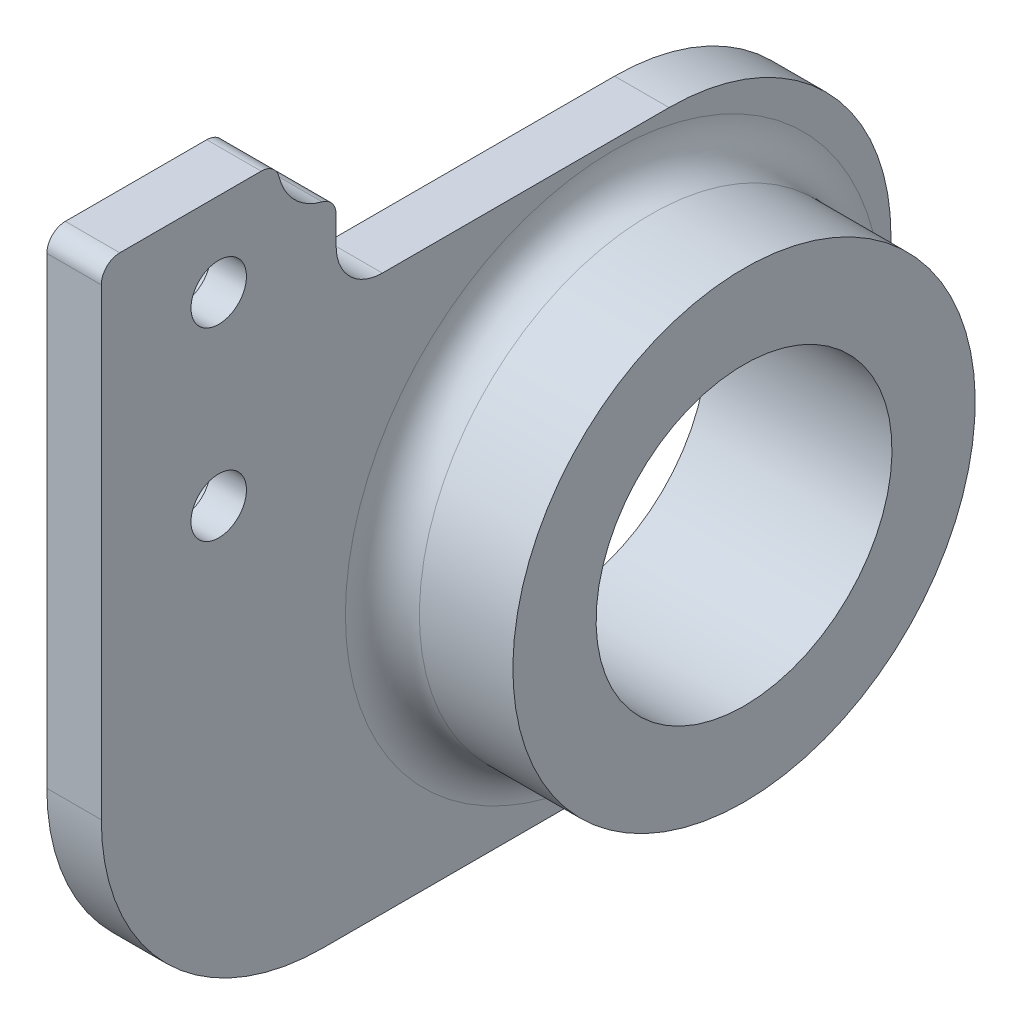
ISO-10303-21;
HEADER;
FILE_DESCRIPTION(('STEP AP214'),'2;1');
FILE_NAME('part.step','',(''),(''),'','','');
FILE_SCHEMA(('AUTOMOTIVE_DESIGN { 1 0 10303 214 1 1 1 1 }'));
ENDSEC;
DATA;
#1=APPLICATION_CONTEXT('core data for automotive mechanical design processes');
#2=APPLICATION_PROTOCOL_DEFINITION('international standard','automotive_design',2000,#1);
#3=PRODUCT_CONTEXT('',#1,'mechanical');
#4=PRODUCT('Part','Part','',(#3));
#5=PRODUCT_RELATED_PRODUCT_CATEGORY('part','',(#4));
#6=PRODUCT_DEFINITION_FORMATION('','',#4);
#7=PRODUCT_DEFINITION_CONTEXT('part definition',#1,'design');
#8=PRODUCT_DEFINITION('design','',#6,#7);
#9=PRODUCT_DEFINITION_SHAPE('','',#8);
#10=(LENGTH_UNIT() NAMED_UNIT(*) SI_UNIT(.MILLI.,.METRE.));
#11=(NAMED_UNIT(*) PLANE_ANGLE_UNIT() SI_UNIT($,.RADIAN.));
#12=(NAMED_UNIT(*) SI_UNIT($,.STERADIAN.) SOLID_ANGLE_UNIT());
#13=UNCERTAINTY_MEASURE_WITH_UNIT(LENGTH_MEASURE(1.E-05),#10,'distance_accuracy_value','');
#14=(GEOMETRIC_REPRESENTATION_CONTEXT(3) GLOBAL_UNCERTAINTY_ASSIGNED_CONTEXT((#13)) GLOBAL_UNIT_ASSIGNED_CONTEXT((#10,
#11,#12)) REPRESENTATION_CONTEXT('',''));
#15=CARTESIAN_POINT('',(0.,0.,0.));
#16=DIRECTION('',(0.,0.,1.));
#17=DIRECTION('',(1.,0.,0.));
#18=AXIS2_PLACEMENT_3D('',#15,#16,#17);
#19=CARTESIAN_POINT('',(-19.525,-4.525,19.05));
#20=DIRECTION('',(1.,0.,0.));
#21=DIRECTION('',(0.,1.,0.));
#22=AXIS2_PLACEMENT_3D('',#19,#20,#21);
#23=CYLINDRICAL_SURFACE('',#22,1.5);
#24=CARTESIAN_POINT('',(-16.5811440184248,-4.525,19.05));
#25=DIRECTION('',(-1.,0.,0.));
#26=DIRECTION('',(0.,-1.,0.));
#27=AXIS2_PLACEMENT_3D('',#24,#25,#26);
#28=CIRCLE('',#27,1.5);
#29=CARTESIAN_POINT('',(-16.5811440184248,-6.025,19.05));
#30=VERTEX_POINT('',#29);
#31=EDGE_CURVE('E329',#30,#30,#28,.T.);
#32=ORIENTED_EDGE('',*,*,#31,.F.);
#33=EDGE_LOOP('',(#32));
#34=FACE_BOUND('',#33,.T.);
#35=CARTESIAN_POINT('',(-18.525,-4.525,19.05));
#36=DIRECTION('',(-1.,0.,0.));
#37=DIRECTION('',(0.,-1.,0.));
#38=AXIS2_PLACEMENT_3D('',#35,#36,#37);
#39=CIRCLE('',#38,1.5);
#40=CARTESIAN_POINT('',(-18.525,-6.025,19.05));
#41=VERTEX_POINT('',#40);
#42=EDGE_CURVE('E219',#41,#41,#39,.T.);
#43=ORIENTED_EDGE('',*,*,#42,.T.);
#44=EDGE_LOOP('',(#43));
#45=FACE_BOUND('',#44,.T.);
#46=ADVANCED_FACE('F43',(#34,#45),#23,.F.);
#47=CARTESIAN_POINT('',(-19.525,-14.525,19.05));
#48=DIRECTION('',(1.,0.,0.));
#49=DIRECTION('',(0.,1.,0.));
#50=AXIS2_PLACEMENT_3D('',#47,#48,#49);
#51=CYLINDRICAL_SURFACE('',#50,1.5);
#52=CARTESIAN_POINT('',(-16.5811440184248,-14.525,19.05));
#53=DIRECTION('',(-1.,0.,0.));
#54=DIRECTION('',(0.,-1.,0.));
#55=AXIS2_PLACEMENT_3D('',#52,#53,#54);
#56=CIRCLE('',#55,1.5);
#57=CARTESIAN_POINT('',(-16.5811440184248,-16.025,19.05));
#58=VERTEX_POINT('',#57);
#59=EDGE_CURVE('E157',#58,#58,#56,.T.);
#60=ORIENTED_EDGE('',*,*,#59,.F.);
#61=EDGE_LOOP('',(#60));
#62=FACE_BOUND('',#61,.T.);
#63=CARTESIAN_POINT('',(-18.525,-14.525,19.05));
#64=DIRECTION('',(-1.,0.,0.));
#65=DIRECTION('',(0.,-1.,0.));
#66=AXIS2_PLACEMENT_3D('',#63,#64,#65);
#67=CIRCLE('',#66,1.5);
#68=CARTESIAN_POINT('',(-18.525,-16.025,19.05));
#69=VERTEX_POINT('',#68);
#70=EDGE_CURVE('E216',#69,#69,#67,.T.);
#71=ORIENTED_EDGE('',*,*,#70,.T.);
#72=EDGE_LOOP('',(#71));
#73=FACE_BOUND('',#72,.T.);
#74=ADVANCED_FACE('F238',(#62,#73),#51,.F.);
#75=CARTESIAN_POINT('',(0.,0.,12.7));
#76=DIRECTION('',(0.,0.,1.));
#77=DIRECTION('',(1.,0.,0.));
#78=AXIS2_PLACEMENT_3D('',#75,#76,#77);
#79=PLANE('',#78);
#80=DIRECTION('',(0.,-1.,0.));
#81=VECTOR('',#80,1.);
#82=CARTESIAN_POINT('',(-16.5811440184248,0.,12.7));
#83=LINE('',#82,#81);
#84=CARTESIAN_POINT('',(-16.5811440184248,-4.0534707350615,12.7));
#85=VERTEX_POINT('',#84);
#86=CARTESIAN_POINT('',(-16.5811440184248,-5.55,12.7));
#87=VERTEX_POINT('',#86);
#88=EDGE_CURVE('E321',#85,#87,#83,.T.);
#89=ORIENTED_EDGE('',*,*,#88,.T.);
#90=DIRECTION('',(-1.,0.,0.));
#91=VECTOR('',#90,1.);
#92=CARTESIAN_POINT('',(0.,-5.55000000000001,12.7));
#93=LINE('',#92,#91);
#94=CARTESIAN_POINT('',(-19.525,-5.55,12.7));
#95=VERTEX_POINT('',#94);
#96=EDGE_CURVE('E175',#87,#95,#93,.T.);
#97=ORIENTED_EDGE('',*,*,#96,.T.);
#98=DIRECTION('',(0.,-1.,0.));
#99=VECTOR('',#98,1.);
#100=CARTESIAN_POINT('',(-19.525,-19.05,12.7));
#101=LINE('',#100,#99);
#102=CARTESIAN_POINT('',(-19.525,-4.0534707350615,12.7));
#103=VERTEX_POINT('',#102);
#104=EDGE_CURVE('E335',#103,#95,#101,.T.);
#105=ORIENTED_EDGE('',*,*,#104,.F.);
#106=DIRECTION('',(-1.,0.,0.));
#107=VECTOR('',#106,1.);
#108=CARTESIAN_POINT('',(-8.98025612106915,-4.0534707350615,12.7));
#109=LINE('',#108,#107);
#110=EDGE_CURVE('E173',#103,#85,#109,.F.);
#111=ORIENTED_EDGE('',*,*,#110,.T.);
#112=EDGE_LOOP('',(#89,#97,#105,#111));
#113=FACE_BOUND('',#112,.T.);
#114=ADVANCED_FACE('F245',(#113),#79,.F.);
#115=CARTESIAN_POINT('',(-19.525,0.,12.7));
#116=DIRECTION('',(0.,-1.,0.));
#117=DIRECTION('',(0.,0.,-1.));
#118=AXIS2_PLACEMENT_3D('',#115,#116,#117);
#119=PLANE('',#118);
#120=DIRECTION('',(1.,0.,0.));
#121=VECTOR('',#120,1.);
#122=CARTESIAN_POINT('',(-13.6372880368496,0.,24.4));
#123=LINE('',#122,#121);
#124=CARTESIAN_POINT('',(-19.525,0.,24.4));
#125=VERTEX_POINT('',#124);
#126=CARTESIAN_POINT('',(-16.5811440184248,0.,24.4));
#127=VERTEX_POINT('',#126);
#128=EDGE_CURVE('E166',#125,#127,#123,.T.);
#129=ORIENTED_EDGE('',*,*,#128,.T.);
#130=DIRECTION('',(0.,0.,1.));
#131=VECTOR('',#130,1.);
#132=CARTESIAN_POINT('',(-16.5811440184248,0.,-0.842098790918986));
#133=LINE('',#132,#131);
#134=CARTESIAN_POINT('',(-16.5811440184248,0.,16.7534707350615));
#135=VERTEX_POINT('',#134);
#136=EDGE_CURVE('E149',#135,#127,#133,.T.);
#137=ORIENTED_EDGE('',*,*,#136,.F.);
#138=DIRECTION('',(-1.,0.,0.));
#139=VECTOR('',#138,1.);
#140=CARTESIAN_POINT('',(-19.525,0.,16.7534707350615));
#141=LINE('',#140,#139);
#142=CARTESIAN_POINT('',(-19.525,0.,16.7534707350615));
#143=VERTEX_POINT('',#142);
#144=EDGE_CURVE('E163',#135,#143,#141,.T.);
#145=ORIENTED_EDGE('',*,*,#144,.T.);
#146=DIRECTION('',(0.,0.,-1.));
#147=VECTOR('',#146,1.);
#148=CARTESIAN_POINT('',(-19.525,0.,12.7));
#149=LINE('',#148,#147);
#150=EDGE_CURVE('E340',#125,#143,#149,.T.);
#151=ORIENTED_EDGE('',*,*,#150,.F.);
#152=EDGE_LOOP('',(#129,#137,#145,#151));
#153=FACE_BOUND('',#152,.T.);
#154=ADVANCED_FACE('F161',(#153),#119,.F.);
#155=CARTESIAN_POINT('',(0.,0.,25.4));
#156=DIRECTION('',(0.,0.,1.));
#157=DIRECTION('',(1.,0.,0.));
#158=AXIS2_PLACEMENT_3D('',#155,#156,#157);
#159=PLANE('',#158);
#160=DIRECTION('',(0.,1.,0.));
#161=VECTOR('',#160,1.);
#162=CARTESIAN_POINT('',(-19.525,0.,25.4));
#163=LINE('',#162,#161);
#164=CARTESIAN_POINT('',(-19.525,-26.05,25.4));
#165=VERTEX_POINT('',#164);
#166=CARTESIAN_POINT('',(-19.525,-1.,25.4));
#167=VERTEX_POINT('',#166);
#168=EDGE_CURVE('E338',#165,#167,#163,.T.);
#169=ORIENTED_EDGE('',*,*,#168,.F.);
#170=DIRECTION('',(-1.,0.,0.));
#171=VECTOR('',#170,1.);
#172=CARTESIAN_POINT('',(0.,-26.05,25.4));
#173=LINE('',#172,#171);
#174=CARTESIAN_POINT('',(-16.5811440184248,-26.05,25.4));
#175=VERTEX_POINT('',#174);
#176=EDGE_CURVE('E202',#165,#175,#173,.F.);
#177=ORIENTED_EDGE('',*,*,#176,.T.);
#178=DIRECTION('',(0.,-1.,0.));
#179=VECTOR('',#178,1.);
#180=CARTESIAN_POINT('',(-16.5811440184248,0.,25.4));
#181=LINE('',#180,#179);
#182=CARTESIAN_POINT('',(-16.5811440184248,-1.,25.4));
#183=VERTEX_POINT('',#182);
#184=EDGE_CURVE('E167',#183,#175,#181,.T.);
#185=ORIENTED_EDGE('',*,*,#184,.F.);
#186=DIRECTION('',(1.,0.,0.));
#187=VECTOR('',#186,1.);
#188=CARTESIAN_POINT('',(-19.525,-1.,25.4));
#189=LINE('',#188,#187);
#190=EDGE_CURVE('E342',#183,#167,#189,.F.);
#191=ORIENTED_EDGE('',*,*,#190,.T.);
#192=EDGE_LOOP('',(#169,#177,#185,#191));
#193=FACE_BOUND('',#192,.T.);
#194=ADVANCED_FACE('F256',(#193),#159,.T.);
#195=CARTESIAN_POINT('',(-19.525,0.,0.));
#196=DIRECTION('',(1.,0.,0.));
#197=DIRECTION('',(0.,1.,0.));
#198=AXIS2_PLACEMENT_3D('',#195,#196,#197);
#199=PLANE('',#198);
#200=CARTESIAN_POINT('',(-19.525,-14.525,19.05));
#201=DIRECTION('',(-1.,0.,0.));
#202=DIRECTION('',(0.,-1.,0.));
#203=AXIS2_PLACEMENT_3D('',#200,#201,#202);
#204=CIRCLE('',#203,2.5);
#205=CARTESIAN_POINT('',(-19.525,-17.025,19.05));
#206=VERTEX_POINT('',#205);
#207=EDGE_CURVE('E382',#206,#206,#204,.T.);
#208=ORIENTED_EDGE('',*,*,#207,.F.);
#209=EDGE_LOOP('',(#208));
#210=FACE_BOUND('',#209,.T.);
#211=CARTESIAN_POINT('',(-19.525,-4.525,19.05));
#212=DIRECTION('',(-1.,0.,0.));
#213=DIRECTION('',(0.,-1.,0.));
#214=AXIS2_PLACEMENT_3D('',#211,#212,#213);
#215=CIRCLE('',#214,2.5);
#216=CARTESIAN_POINT('',(-19.525,-7.025,19.05));
#217=VERTEX_POINT('',#216);
#218=EDGE_CURVE('E376',#217,#217,#215,.T.);
#219=ORIENTED_EDGE('',*,*,#218,.F.);
#220=EDGE_LOOP('',(#219));
#221=FACE_BOUND('',#220,.T.);
#222=DIRECTION('',(0.,0.,1.));
#223=VECTOR('',#222,1.);
#224=CARTESIAN_POINT('',(-19.525,-38.05,25.4));
#225=LINE('',#224,#223);
#226=CARTESIAN_POINT('',(-19.525,-38.05,-5.29999999999999));
#227=VERTEX_POINT('',#226);
#228=CARTESIAN_POINT('',(-19.525,-38.05,13.4));
#229=VERTEX_POINT('',#228);
#230=EDGE_CURVE('E314',#227,#229,#225,.T.);
#231=ORIENTED_EDGE('',*,*,#230,.T.);
#232=CARTESIAN_POINT('',(-19.525,-26.05,13.4));
#233=DIRECTION('',(1.,0.,0.));
#234=DIRECTION('',(0.,1.,0.));
#235=AXIS2_PLACEMENT_3D('',#232,#233,#234);
#236=CIRCLE('',#235,12.);
#237=EDGE_CURVE('E200',#229,#165,#236,.F.);
#238=ORIENTED_EDGE('',*,*,#237,.T.);
#239=ORIENTED_EDGE('',*,*,#168,.T.);
#240=CARTESIAN_POINT('',(-19.525,-1.,24.4));
#241=DIRECTION('',(1.,0.,0.));
#242=DIRECTION('',(0.,1.,0.));
#243=AXIS2_PLACEMENT_3D('',#240,#241,#242);
#244=CIRCLE('',#243,1.);
#245=EDGE_CURVE('E348',#167,#125,#244,.F.);
#246=ORIENTED_EDGE('',*,*,#245,.T.);
#247=ORIENTED_EDGE('',*,*,#150,.T.);
#248=CARTESIAN_POINT('',(-19.525,-0.999999999999999,16.7534707350615));
#249=DIRECTION('',(1.,0.,0.));
#250=DIRECTION('',(0.,1.,0.));
#251=AXIS2_PLACEMENT_3D('',#248,#249,#250);
#252=CIRCLE('',#251,1.);
#253=CARTESIAN_POINT('',(-19.525,-0.760479041916167,15.7825795410348));
#254=VERTEX_POINT('',#253);
#255=EDGE_CURVE('E172',#143,#254,#252,.F.);
#256=ORIENTED_EDGE('',*,*,#255,.T.);
#257=CARTESIAN_POINT('',(-19.525,0.,12.7));
#258=DIRECTION('',(-1.,0.,0.));
#259=DIRECTION('',(0.,0.,1.));
#260=AXIS2_PLACEMENT_3D('',#257,#258,#259);
#261=CIRCLE('',#260,3.175);
#262=CARTESIAN_POINT('',(-19.525,-3.08257954103479,13.4604790419162));
#263=VERTEX_POINT('',#262);
#264=EDGE_CURVE('E332',#263,#254,#261,.T.);
#265=ORIENTED_EDGE('',*,*,#264,.F.);
#266=CARTESIAN_POINT('',(-19.525,-4.0534707350615,13.7));
#267=DIRECTION('',(1.,0.,0.));
#268=DIRECTION('',(0.,1.,0.));
#269=AXIS2_PLACEMENT_3D('',#266,#267,#268);
#270=CIRCLE('',#269,1.);
#271=EDGE_CURVE('E345',#263,#103,#270,.F.);
#272=ORIENTED_EDGE('',*,*,#271,.T.);
#273=ORIENTED_EDGE('',*,*,#104,.T.);
#274=CARTESIAN_POINT('',(-19.525,-5.55,10.2));
#275=DIRECTION('',(1.,0.,0.));
#276=DIRECTION('',(0.,1.,0.));
#277=AXIS2_PLACEMENT_3D('',#274,#275,#276);
#278=CIRCLE('',#277,2.5);
#279=CARTESIAN_POINT('',(-19.525,-8.05,10.2));
#280=VERTEX_POINT('',#279);
#281=EDGE_CURVE('E187',#95,#280,#278,.T.);
#282=ORIENTED_EDGE('',*,*,#281,.T.);
#283=DIRECTION('',(0.,0.,-1.));
#284=VECTOR('',#283,1.);
#285=CARTESIAN_POINT('',(-19.525,-8.05,12.7));
#286=LINE('',#285,#284);
#287=CARTESIAN_POINT('',(-19.525,-8.05000000000001,-5.3));
#288=VERTEX_POINT('',#287);
#289=EDGE_CURVE('E362',#280,#288,#286,.T.);
#290=ORIENTED_EDGE('',*,*,#289,.T.);
#291=CARTESIAN_POINT('',(-19.525,-20.05,-5.3));
#292=DIRECTION('',(1.,0.,0.));
#293=DIRECTION('',(0.,1.,0.));
#294=AXIS2_PLACEMENT_3D('',#291,#292,#293);
#295=CIRCLE('',#294,12.);
#296=CARTESIAN_POINT('',(-19.525,-20.05,-17.3));
#297=VERTEX_POINT('',#296);
#298=EDGE_CURVE('E196',#288,#297,#295,.F.);
#299=ORIENTED_EDGE('',*,*,#298,.T.);
#300=DIRECTION('',(0.,-1.,0.));
#301=VECTOR('',#300,1.);
#302=CARTESIAN_POINT('',(-19.525,-8.05000000000001,-17.3));
#303=LINE('',#302,#301);
#304=CARTESIAN_POINT('',(-19.525,-26.05,-17.3));
#305=VERTEX_POINT('',#304);
#306=EDGE_CURVE('E363',#297,#305,#303,.T.);
#307=ORIENTED_EDGE('',*,*,#306,.T.);
#308=CARTESIAN_POINT('',(-19.525,-26.05,-5.3));
#309=DIRECTION('',(1.,0.,0.));
#310=DIRECTION('',(0.,1.,0.));
#311=AXIS2_PLACEMENT_3D('',#308,#309,#310);
#312=CIRCLE('',#311,12.);
#313=EDGE_CURVE('E198',#305,#227,#312,.F.);
#314=ORIENTED_EDGE('',*,*,#313,.T.);
#315=EDGE_LOOP('',(#231,#238,#239,#246,#247,#256,#265,#272,#273,#282,#290,#299,#307,#314));
#316=FACE_BOUND('',#315,.T.);
#317=CARTESIAN_POINT('',(-19.525,-23.05,-2.3));
#318=DIRECTION('',(-1.,0.,0.));
#319=DIRECTION('',(0.,-1.,0.));
#320=AXIS2_PLACEMENT_3D('',#317,#318,#319);
#321=CIRCLE('',#320,8.);
#322=CARTESIAN_POINT('',(-19.525,-31.05,-2.3));
#323=VERTEX_POINT('',#322);
#324=EDGE_CURVE('E364',#323,#323,#321,.T.);
#325=ORIENTED_EDGE('',*,*,#324,.F.);
#326=EDGE_LOOP('',(#325));
#327=FACE_BOUND('',#326,.T.);
#328=ADVANCED_FACE('F252',(#210,#221,#316,#327),#199,.F.);
#329=CARTESIAN_POINT('',(-19.525,0.,12.7));
#330=DIRECTION('',(1.,0.,0.));
#331=DIRECTION('',(0.,0.,-1.));
#332=AXIS2_PLACEMENT_3D('',#329,#330,#331);
#333=CYLINDRICAL_SURFACE('',#332,3.175);
#334=CARTESIAN_POINT('',(-16.5811440184248,0.,12.7));
#335=DIRECTION('',(-1.,0.,0.));
#336=DIRECTION('',(0.,-1.,0.));
#337=AXIS2_PLACEMENT_3D('',#334,#335,#336);
#338=CIRCLE('',#337,3.175);
#339=CARTESIAN_POINT('',(-16.5811440184248,-3.08257954103479,13.4604790419162));
#340=VERTEX_POINT('',#339);
#341=CARTESIAN_POINT('',(-16.5811440184248,-0.760479041916167,15.7825795410348));
#342=VERTEX_POINT('',#341);
#343=EDGE_CURVE('E152',#340,#342,#338,.T.);
#344=ORIENTED_EDGE('',*,*,#343,.F.);
#345=DIRECTION('',(1.,0.,0.));
#346=VECTOR('',#345,1.);
#347=CARTESIAN_POINT('',(-19.525,-3.08257954103479,13.4604790419162));
#348=LINE('',#347,#346);
#349=EDGE_CURVE('E350',#340,#263,#348,.F.);
#350=ORIENTED_EDGE('',*,*,#349,.T.);
#351=ORIENTED_EDGE('',*,*,#264,.T.);
#352=DIRECTION('',(1.,0.,0.));
#353=VECTOR('',#352,1.);
#354=CARTESIAN_POINT('',(-19.525,-0.760479041916167,15.7825795410348));
#355=LINE('',#354,#353);
#356=EDGE_CURVE('E178',#254,#342,#355,.T.);
#357=ORIENTED_EDGE('',*,*,#356,.T.);
#358=EDGE_LOOP('',(#344,#350,#351,#357));
#359=FACE_BOUND('',#358,.T.);
#360=ADVANCED_FACE('F255',(#359),#333,.F.);
#361=CARTESIAN_POINT('',(-19.525,-0.999999999999999,16.7534707350615));
#362=DIRECTION('',(1.,0.,0.));
#363=DIRECTION('',(0.,0.,-1.));
#364=AXIS2_PLACEMENT_3D('',#361,#362,#363);
#365=CYLINDRICAL_SURFACE('',#364,1.);
#366=CARTESIAN_POINT('',(-16.5811440184248,-0.999999999999999,16.7534707350615));
#367=DIRECTION('',(-1.,0.,0.));
#368=DIRECTION('',(0.,-1.,0.));
#369=AXIS2_PLACEMENT_3D('',#366,#367,#368);
#370=CIRCLE('',#369,1.);
#371=EDGE_CURVE('E144',#342,#135,#370,.F.);
#372=ORIENTED_EDGE('',*,*,#371,.F.);
#373=ORIENTED_EDGE('',*,*,#356,.F.);
#374=ORIENTED_EDGE('',*,*,#255,.F.);
#375=ORIENTED_EDGE('',*,*,#144,.F.);
#376=EDGE_LOOP('',(#372,#373,#374,#375));
#377=FACE_BOUND('',#376,.T.);
#378=ADVANCED_FACE('F171',(#377),#365,.T.);
#379=CARTESIAN_POINT('',(-19.525,-4.0534707350615,13.7));
#380=DIRECTION('',(1.,0.,0.));
#381=DIRECTION('',(0.,0.,-1.));
#382=AXIS2_PLACEMENT_3D('',#379,#380,#381);
#383=CYLINDRICAL_SURFACE('',#382,1.);
#384=CARTESIAN_POINT('',(-16.5811440184248,-4.0534707350615,13.7));
#385=DIRECTION('',(-1.,0.,0.));
#386=DIRECTION('',(0.,-1.,0.));
#387=AXIS2_PLACEMENT_3D('',#384,#385,#386);
#388=CIRCLE('',#387,1.);
#389=EDGE_CURVE('E324',#85,#340,#388,.F.);
#390=ORIENTED_EDGE('',*,*,#389,.F.);
#391=ORIENTED_EDGE('',*,*,#110,.F.);
#392=ORIENTED_EDGE('',*,*,#271,.F.);
#393=ORIENTED_EDGE('',*,*,#349,.F.);
#394=EDGE_LOOP('',(#390,#391,#392,#393));
#395=FACE_BOUND('',#394,.T.);
#396=ADVANCED_FACE('F266',(#395),#383,.T.);
#397=CARTESIAN_POINT('',(-19.525,-1.,24.4));
#398=DIRECTION('',(-1.,0.,0.));
#399=DIRECTION('',(0.,-1.,0.));
#400=AXIS2_PLACEMENT_3D('',#397,#398,#399);
#401=CYLINDRICAL_SURFACE('',#400,1.);
#402=CARTESIAN_POINT('',(-16.5811440184248,-1.,24.4));
#403=DIRECTION('',(-1.,0.,0.));
#404=DIRECTION('',(0.,-1.,0.));
#405=AXIS2_PLACEMENT_3D('',#402,#403,#404);
#406=CIRCLE('',#405,1.);
#407=EDGE_CURVE('E319',#127,#183,#406,.F.);
#408=ORIENTED_EDGE('',*,*,#407,.F.);
#409=ORIENTED_EDGE('',*,*,#128,.F.);
#410=ORIENTED_EDGE('',*,*,#245,.F.);
#411=ORIENTED_EDGE('',*,*,#190,.F.);
#412=EDGE_LOOP('',(#408,#409,#410,#411));
#413=FACE_BOUND('',#412,.T.);
#414=ADVANCED_FACE('F269',(#413),#401,.T.);
#415=CARTESIAN_POINT('',(-16.5811440184248,0.,-0.842098790918986));
#416=DIRECTION('',(-1.,0.,0.));
#417=DIRECTION('',(0.,-1.,0.));
#418=AXIS2_PLACEMENT_3D('',#415,#416,#417);
#419=PLANE('',#418);
#420=CARTESIAN_POINT('',(-16.5811440184248,-23.05,-2.3));
#421=DIRECTION('',(-1.,0.,0.));
#422=DIRECTION('',(0.,-1.,0.));
#423=AXIS2_PLACEMENT_3D('',#420,#421,#422);
#424=CIRCLE('',#423,14.5);
#425=CARTESIAN_POINT('',(-16.5811440184248,-37.55,-2.3));
#426=VERTEX_POINT('',#425);
#427=EDGE_CURVE('E51',#426,#426,#424,.T.);
#428=ORIENTED_EDGE('',*,*,#427,.T.);
#429=EDGE_LOOP('',(#428));
#430=FACE_BOUND('',#429,.T.);
#431=ORIENTED_EDGE('',*,*,#184,.T.);
#432=CARTESIAN_POINT('',(-16.5811440184248,-26.05,13.4));
#433=DIRECTION('',(-1.,0.,0.));
#434=DIRECTION('',(0.,-1.,0.));
#435=AXIS2_PLACEMENT_3D('',#432,#433,#434);
#436=CIRCLE('',#435,12.);
#437=CARTESIAN_POINT('',(-16.5811440184248,-38.05,13.4));
#438=VERTEX_POINT('',#437);
#439=EDGE_CURVE('E207',#175,#438,#436,.F.);
#440=ORIENTED_EDGE('',*,*,#439,.T.);
#441=DIRECTION('',(0.,0.,-1.));
#442=VECTOR('',#441,1.);
#443=CARTESIAN_POINT('',(-16.5811440184248,-38.05,25.4));
#444=LINE('',#443,#442);
#445=CARTESIAN_POINT('',(-16.5811440184248,-38.05,-5.3));
#446=VERTEX_POINT('',#445);
#447=EDGE_CURVE('E309',#438,#446,#444,.T.);
#448=ORIENTED_EDGE('',*,*,#447,.T.);
#449=CARTESIAN_POINT('',(-16.5811440184248,-26.05,-5.3));
#450=DIRECTION('',(-1.,0.,0.));
#451=DIRECTION('',(0.,-1.,0.));
#452=AXIS2_PLACEMENT_3D('',#449,#450,#451);
#453=CIRCLE('',#452,12.);
#454=CARTESIAN_POINT('',(-16.5811440184248,-26.05,-17.3));
#455=VERTEX_POINT('',#454);
#456=EDGE_CURVE('E65',#446,#455,#453,.F.);
#457=ORIENTED_EDGE('',*,*,#456,.T.);
#458=DIRECTION('',(0.,1.,0.));
#459=VECTOR('',#458,1.);
#460=CARTESIAN_POINT('',(-16.5811440184248,-8.05000000000002,-17.3));
#461=LINE('',#460,#459);
#462=CARTESIAN_POINT('',(-16.5811440184248,-20.05,-17.3));
#463=VERTEX_POINT('',#462);
#464=EDGE_CURVE('E302',#455,#463,#461,.T.);
#465=ORIENTED_EDGE('',*,*,#464,.T.);
#466=CARTESIAN_POINT('',(-16.5811440184248,-20.05,-5.3));
#467=DIRECTION('',(-1.,0.,0.));
#468=DIRECTION('',(0.,-1.,0.));
#469=AXIS2_PLACEMENT_3D('',#466,#467,#468);
#470=CIRCLE('',#469,12.);
#471=CARTESIAN_POINT('',(-16.5811440184248,-8.05000000000001,-5.3));
#472=VERTEX_POINT('',#471);
#473=EDGE_CURVE('E204',#463,#472,#470,.F.);
#474=ORIENTED_EDGE('',*,*,#473,.T.);
#475=DIRECTION('',(0.,0.,1.));
#476=VECTOR('',#475,1.);
#477=CARTESIAN_POINT('',(-16.5811440184248,-8.05,12.7));
#478=LINE('',#477,#476);
#479=CARTESIAN_POINT('',(-16.5811440184248,-8.05,10.2));
#480=VERTEX_POINT('',#479);
#481=EDGE_CURVE('E168',#472,#480,#478,.T.);
#482=ORIENTED_EDGE('',*,*,#481,.T.);
#483=CARTESIAN_POINT('',(-16.5811440184248,-5.55,10.2));
#484=DIRECTION('',(-1.,0.,0.));
#485=DIRECTION('',(0.,-1.,0.));
#486=AXIS2_PLACEMENT_3D('',#483,#484,#485);
#487=CIRCLE('',#486,2.5);
#488=EDGE_CURVE('E189',#480,#87,#487,.T.);
#489=ORIENTED_EDGE('',*,*,#488,.T.);
#490=ORIENTED_EDGE('',*,*,#88,.F.);
#491=ORIENTED_EDGE('',*,*,#389,.T.);
#492=ORIENTED_EDGE('',*,*,#343,.T.);
#493=ORIENTED_EDGE('',*,*,#371,.T.);
#494=ORIENTED_EDGE('',*,*,#136,.T.);
#495=ORIENTED_EDGE('',*,*,#407,.T.);
#496=EDGE_LOOP('',(#431,#440,#448,#457,#465,#474,#482,#489,#490,#491,#492,#493,#494,#495));
#497=FACE_BOUND('',#496,.T.);
#498=ORIENTED_EDGE('',*,*,#31,.T.);
#499=EDGE_LOOP('',(#498));
#500=FACE_BOUND('',#499,.T.);
#501=ORIENTED_EDGE('',*,*,#59,.T.);
#502=EDGE_LOOP('',(#501));
#503=FACE_BOUND('',#502,.T.);
#504=ADVANCED_FACE('F147',(#430,#497,#500,#503),#419,.F.);
#505=CARTESIAN_POINT('',(35.6040071263214,-38.05,25.4));
#506=DIRECTION('',(0.,-1.,0.));
#507=DIRECTION('',(0.,0.,-1.));
#508=AXIS2_PLACEMENT_3D('',#505,#506,#507);
#509=PLANE('',#508);
#510=ORIENTED_EDGE('',*,*,#447,.F.);
#511=DIRECTION('',(-1.,0.,0.));
#512=VECTOR('',#511,1.);
#513=CARTESIAN_POINT('',(35.6040071263214,-38.05,13.4));
#514=LINE('',#513,#512);
#515=EDGE_CURVE('E193',#438,#229,#514,.T.);
#516=ORIENTED_EDGE('',*,*,#515,.T.);
#517=ORIENTED_EDGE('',*,*,#230,.F.);
#518=DIRECTION('',(-1.,0.,0.));
#519=VECTOR('',#518,1.);
#520=CARTESIAN_POINT('',(35.6040071263214,-38.05,-5.3));
#521=LINE('',#520,#519);
#522=EDGE_CURVE('E191',#227,#446,#521,.F.);
#523=ORIENTED_EDGE('',*,*,#522,.T.);
#524=EDGE_LOOP('',(#510,#516,#517,#523));
#525=FACE_BOUND('',#524,.T.);
#526=ADVANCED_FACE('F414',(#525),#509,.T.);
#527=CARTESIAN_POINT('',(35.6040071263214,-8.05000000000001,-17.3));
#528=DIRECTION('',(0.,0.,-1.));
#529=DIRECTION('',(0.,1.,0.));
#530=AXIS2_PLACEMENT_3D('',#527,#528,#529);
#531=PLANE('',#530);
#532=ORIENTED_EDGE('',*,*,#464,.F.);
#533=DIRECTION('',(-1.,0.,0.));
#534=VECTOR('',#533,1.);
#535=CARTESIAN_POINT('',(35.6040071263214,-26.05,-17.3));
#536=LINE('',#535,#534);
#537=EDGE_CURVE('E210',#455,#305,#536,.T.);
#538=ORIENTED_EDGE('',*,*,#537,.T.);
#539=ORIENTED_EDGE('',*,*,#306,.F.);
#540=DIRECTION('',(-1.,0.,0.));
#541=VECTOR('',#540,1.);
#542=CARTESIAN_POINT('',(35.6040071263214,-20.05,-17.3));
#543=LINE('',#542,#541);
#544=EDGE_CURVE('E58',#297,#463,#543,.F.);
#545=ORIENTED_EDGE('',*,*,#544,.T.);
#546=EDGE_LOOP('',(#532,#538,#539,#545));
#547=FACE_BOUND('',#546,.T.);
#548=ADVANCED_FACE('F417',(#547),#531,.T.);
#549=CARTESIAN_POINT('',(35.6040071263214,-8.05000000000001,12.7));
#550=DIRECTION('',(0.,1.,0.));
#551=DIRECTION('',(0.,0.,1.));
#552=AXIS2_PLACEMENT_3D('',#549,#550,#551);
#553=PLANE('',#552);
#554=ORIENTED_EDGE('',*,*,#481,.F.);
#555=DIRECTION('',(-1.,0.,0.));
#556=VECTOR('',#555,1.);
#557=CARTESIAN_POINT('',(35.6040071263214,-8.05000000000001,-5.3));
#558=LINE('',#557,#556);
#559=EDGE_CURVE('E213',#472,#288,#558,.T.);
#560=ORIENTED_EDGE('',*,*,#559,.T.);
#561=ORIENTED_EDGE('',*,*,#289,.F.);
#562=DIRECTION('',(-1.,0.,0.));
#563=VECTOR('',#562,1.);
#564=CARTESIAN_POINT('',(35.6040071263214,-8.05000000000001,10.2));
#565=LINE('',#564,#563);
#566=EDGE_CURVE('E184',#280,#480,#565,.F.);
#567=ORIENTED_EDGE('',*,*,#566,.T.);
#568=EDGE_LOOP('',(#554,#560,#561,#567));
#569=FACE_BOUND('',#568,.T.);
#570=ADVANCED_FACE('F304',(#569),#553,.T.);
#571=CARTESIAN_POINT('',(-16.5811440184248,-23.05,-2.3));
#572=DIRECTION('',(-1.,0.,0.));
#573=DIRECTION('',(0.,-1.,0.));
#574=AXIS2_PLACEMENT_3D('',#571,#572,#573);
#575=CYLINDRICAL_SURFACE('',#574,8.);
#576=ORIENTED_EDGE('',*,*,#324,.T.);
#577=EDGE_LOOP('',(#576));
#578=FACE_BOUND('',#577,.T.);
#579=CARTESIAN_POINT('',(-9.525,-23.05,-2.3));
#580=DIRECTION('',(-1.,0.,0.));
#581=DIRECTION('',(0.,-1.,0.));
#582=AXIS2_PLACEMENT_3D('',#579,#580,#581);
#583=CIRCLE('',#582,8.);
#584=CARTESIAN_POINT('',(-9.525,-31.05,-2.3));
#585=VERTEX_POINT('',#584);
#586=EDGE_CURVE('E222',#585,#585,#583,.T.);
#587=ORIENTED_EDGE('',*,*,#586,.F.);
#588=EDGE_LOOP('',(#587));
#589=FACE_BOUND('',#588,.T.);
#590=ADVANCED_FACE('F280',(#578,#589),#575,.F.);
#591=CARTESIAN_POINT('',(0.,-5.55000000000001,10.2));
#592=DIRECTION('',(-1.,0.,0.));
#593=DIRECTION('',(0.,-1.,0.));
#594=AXIS2_PLACEMENT_3D('',#591,#592,#593);
#595=CYLINDRICAL_SURFACE('',#594,2.5);
#596=ORIENTED_EDGE('',*,*,#488,.F.);
#597=ORIENTED_EDGE('',*,*,#566,.F.);
#598=ORIENTED_EDGE('',*,*,#281,.F.);
#599=ORIENTED_EDGE('',*,*,#96,.F.);
#600=EDGE_LOOP('',(#596,#597,#598,#599));
#601=FACE_BOUND('',#600,.T.);
#602=ADVANCED_FACE('F276',(#601),#595,.F.);
#603=CARTESIAN_POINT('',(35.6040071263214,-26.05,13.4));
#604=DIRECTION('',(-1.,0.,0.));
#605=DIRECTION('',(0.,-1.,0.));
#606=AXIS2_PLACEMENT_3D('',#603,#604,#605);
#607=CYLINDRICAL_SURFACE('',#606,12.);
#608=ORIENTED_EDGE('',*,*,#439,.F.);
#609=ORIENTED_EDGE('',*,*,#176,.F.);
#610=ORIENTED_EDGE('',*,*,#237,.F.);
#611=ORIENTED_EDGE('',*,*,#515,.F.);
#612=EDGE_LOOP('',(#608,#609,#610,#611));
#613=FACE_BOUND('',#612,.T.);
#614=ADVANCED_FACE('F279',(#613),#607,.T.);
#615=CARTESIAN_POINT('',(35.6040071263214,-26.05,-5.3));
#616=DIRECTION('',(-1.,0.,0.));
#617=DIRECTION('',(0.,-1.,0.));
#618=AXIS2_PLACEMENT_3D('',#615,#616,#617);
#619=CYLINDRICAL_SURFACE('',#618,12.);
#620=ORIENTED_EDGE('',*,*,#456,.F.);
#621=ORIENTED_EDGE('',*,*,#522,.F.);
#622=ORIENTED_EDGE('',*,*,#313,.F.);
#623=ORIENTED_EDGE('',*,*,#537,.F.);
#624=EDGE_LOOP('',(#620,#621,#622,#623));
#625=FACE_BOUND('',#624,.T.);
#626=ADVANCED_FACE('F284',(#625),#619,.T.);
#627=CARTESIAN_POINT('',(35.6040071263214,-20.05,-5.3));
#628=DIRECTION('',(-1.,0.,0.));
#629=DIRECTION('',(0.,-1.,0.));
#630=AXIS2_PLACEMENT_3D('',#627,#628,#629);
#631=CYLINDRICAL_SURFACE('',#630,12.);
#632=ORIENTED_EDGE('',*,*,#473,.F.);
#633=ORIENTED_EDGE('',*,*,#544,.F.);
#634=ORIENTED_EDGE('',*,*,#298,.F.);
#635=ORIENTED_EDGE('',*,*,#559,.F.);
#636=EDGE_LOOP('',(#632,#633,#634,#635));
#637=FACE_BOUND('',#636,.T.);
#638=ADVANCED_FACE('F287',(#637),#631,.T.);
#639=CARTESIAN_POINT('',(-9.525,-23.05,-2.3));
#640=DIRECTION('',(-1.,0.,0.));
#641=DIRECTION('',(0.,-1.,0.));
#642=AXIS2_PLACEMENT_3D('',#639,#640,#641);
#643=CYLINDRICAL_SURFACE('',#642,12.5);
#644=CARTESIAN_POINT('',(-14.5811440184248,-23.05,-2.3));
#645=DIRECTION('',(-1.,0.,0.));
#646=DIRECTION('',(0.,-1.,0.));
#647=AXIS2_PLACEMENT_3D('',#644,#645,#646);
#648=CIRCLE('',#647,12.5);
#649=CARTESIAN_POINT('',(-14.5811440184248,-35.55,-2.3));
#650=VERTEX_POINT('',#649);
#651=EDGE_CURVE('E11',#650,#650,#648,.F.);
#652=ORIENTED_EDGE('',*,*,#651,.T.);
#653=EDGE_LOOP('',(#652));
#654=FACE_BOUND('',#653,.T.);
#655=CARTESIAN_POINT('',(-9.525,-23.05,-2.3));
#656=DIRECTION('',(-1.,0.,0.));
#657=DIRECTION('',(0.,-1.,0.));
#658=AXIS2_PLACEMENT_3D('',#655,#656,#657);
#659=CIRCLE('',#658,12.5);
#660=CARTESIAN_POINT('',(-9.52500000000001,-35.55,-2.3));
#661=VERTEX_POINT('',#660);
#662=EDGE_CURVE('E368',#661,#661,#659,.T.);
#663=ORIENTED_EDGE('',*,*,#662,.T.);
#664=EDGE_LOOP('',(#663));
#665=FACE_BOUND('',#664,.T.);
#666=ADVANCED_FACE('F290',(#654,#665),#643,.T.);
#667=CARTESIAN_POINT('',(-9.525,-23.05,-2.3));
#668=DIRECTION('',(-1.,0.,0.));
#669=DIRECTION('',(0.,-1.,0.));
#670=AXIS2_PLACEMENT_3D('',#667,#668,#669);
#671=PLANE('',#670);
#672=ORIENTED_EDGE('',*,*,#586,.T.);
#673=EDGE_LOOP('',(#672));
#674=FACE_BOUND('',#673,.T.);
#675=ORIENTED_EDGE('',*,*,#662,.F.);
#676=EDGE_LOOP('',(#675));
#677=FACE_BOUND('',#676,.T.);
#678=ADVANCED_FACE('F296',(#674,#677),#671,.F.);
#679=CARTESIAN_POINT('',(-18.525,-14.525,19.05));
#680=DIRECTION('',(-1.,0.,0.));
#681=DIRECTION('',(0.,-1.,0.));
#682=AXIS2_PLACEMENT_3D('',#679,#680,#681);
#683=CYLINDRICAL_SURFACE('',#682,2.5);
#684=CARTESIAN_POINT('',(-18.525,-14.525,19.05));
#685=DIRECTION('',(-1.,0.,0.));
#686=DIRECTION('',(0.,-1.,0.));
#687=AXIS2_PLACEMENT_3D('',#684,#685,#686);
#688=CIRCLE('',#687,2.5);
#689=CARTESIAN_POINT('',(-18.525,-17.025,19.05));
#690=VERTEX_POINT('',#689);
#691=EDGE_CURVE('E220',#690,#690,#688,.T.);
#692=ORIENTED_EDGE('',*,*,#691,.F.);
#693=EDGE_LOOP('',(#692));
#694=FACE_BOUND('',#693,.T.);
#695=ORIENTED_EDGE('',*,*,#207,.T.);
#696=EDGE_LOOP('',(#695));
#697=FACE_BOUND('',#696,.T.);
#698=ADVANCED_FACE('F390',(#694,#697),#683,.F.);
#699=CARTESIAN_POINT('',(-18.525,-14.525,19.05));
#700=DIRECTION('',(-1.,0.,0.));
#701=DIRECTION('',(0.,-1.,0.));
#702=AXIS2_PLACEMENT_3D('',#699,#700,#701);
#703=PLANE('',#702);
#704=ORIENTED_EDGE('',*,*,#70,.F.);
#705=EDGE_LOOP('',(#704));
#706=FACE_BOUND('',#705,.T.);
#707=ORIENTED_EDGE('',*,*,#691,.T.);
#708=EDGE_LOOP('',(#707));
#709=FACE_BOUND('',#708,.T.);
#710=ADVANCED_FACE('F388',(#706,#709),#703,.T.);
#711=CARTESIAN_POINT('',(-18.525,-4.525,19.05));
#712=DIRECTION('',(-1.,0.,0.));
#713=DIRECTION('',(0.,-1.,0.));
#714=AXIS2_PLACEMENT_3D('',#711,#712,#713);
#715=CYLINDRICAL_SURFACE('',#714,2.5);
#716=CARTESIAN_POINT('',(-18.525,-4.525,19.05));
#717=DIRECTION('',(-1.,0.,0.));
#718=DIRECTION('',(0.,-1.,0.));
#719=AXIS2_PLACEMENT_3D('',#716,#717,#718);
#720=CIRCLE('',#719,2.5);
#721=CARTESIAN_POINT('',(-18.525,-7.025,19.05));
#722=VERTEX_POINT('',#721);
#723=EDGE_CURVE('E379',#722,#722,#720,.T.);
#724=ORIENTED_EDGE('',*,*,#723,.F.);
#725=EDGE_LOOP('',(#724));
#726=FACE_BOUND('',#725,.T.);
#727=ORIENTED_EDGE('',*,*,#218,.T.);
#728=EDGE_LOOP('',(#727));
#729=FACE_BOUND('',#728,.T.);
#730=ADVANCED_FACE('F233',(#726,#729),#715,.F.);
#731=CARTESIAN_POINT('',(-18.525,-4.525,19.05));
#732=DIRECTION('',(-1.,0.,0.));
#733=DIRECTION('',(0.,-1.,0.));
#734=AXIS2_PLACEMENT_3D('',#731,#732,#733);
#735=PLANE('',#734);
#736=ORIENTED_EDGE('',*,*,#42,.F.);
#737=EDGE_LOOP('',(#736));
#738=FACE_BOUND('',#737,.T.);
#739=ORIENTED_EDGE('',*,*,#723,.T.);
#740=EDGE_LOOP('',(#739));
#741=FACE_BOUND('',#740,.T.);
#742=ADVANCED_FACE('F228',(#738,#741),#735,.T.);
#743=CARTESIAN_POINT('',(-14.5811440184248,-23.05,-2.3));
#744=DIRECTION('',(-1.,0.,0.));
#745=DIRECTION('',(0.,-1.,0.));
#746=AXIS2_PLACEMENT_3D('',#743,#744,#745);
#747=TOROIDAL_SURFACE('',#746,14.5,2.);
#748=ORIENTED_EDGE('',*,*,#651,.F.);
#749=EDGE_LOOP('',(#748));
#750=FACE_BOUND('',#749,.T.);
#751=ORIENTED_EDGE('',*,*,#427,.F.);
#752=EDGE_LOOP('',(#751));
#753=FACE_BOUND('',#752,.T.);
#754=ADVANCED_FACE('F45',(#750,#753),#747,.F.);
#755=CLOSED_SHELL('',(#46,#74,#114,#154,#194,#328,#360,#378,#396,#414,#504,#526,#548,#570,#590,
#602,#614,#626,#638,#666,#678,#698,#710,#730,#742,#754));
#756=MANIFOLD_SOLID_BREP('B2',#755);
#757=ADVANCED_BREP_SHAPE_REPRESENTATION('',(#18,#756),#14);
#758=SHAPE_DEFINITION_REPRESENTATION(#9,#757);
ENDSEC;
END-ISO-10303-21;
